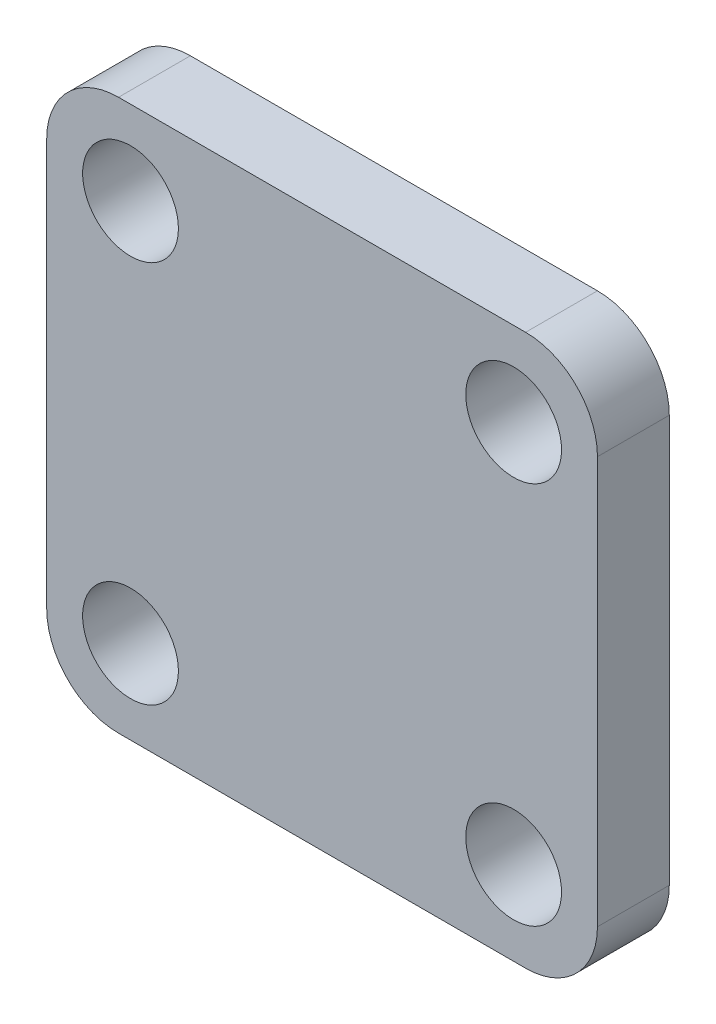
ISO-10303-21;
HEADER;
FILE_DESCRIPTION(('STEP AP214'),'2;1');
FILE_NAME('part.step','',(''),(''),'','','');
FILE_SCHEMA(('AUTOMOTIVE_DESIGN { 1 0 10303 214 1 1 1 1 }'));
ENDSEC;
DATA;
#1=APPLICATION_CONTEXT('core data for automotive mechanical design processes');
#2=APPLICATION_PROTOCOL_DEFINITION('international standard','automotive_design',2000,#1);
#3=PRODUCT_CONTEXT('',#1,'mechanical');
#4=PRODUCT('Part','Part','',(#3));
#5=PRODUCT_RELATED_PRODUCT_CATEGORY('part','',(#4));
#6=PRODUCT_DEFINITION_FORMATION('','',#4);
#7=PRODUCT_DEFINITION_CONTEXT('part definition',#1,'design');
#8=PRODUCT_DEFINITION('design','',#6,#7);
#9=PRODUCT_DEFINITION_SHAPE('','',#8);
#10=(LENGTH_UNIT() NAMED_UNIT(*) SI_UNIT(.MILLI.,.METRE.));
#11=(NAMED_UNIT(*) PLANE_ANGLE_UNIT() SI_UNIT($,.RADIAN.));
#12=(NAMED_UNIT(*) SI_UNIT($,.STERADIAN.) SOLID_ANGLE_UNIT());
#13=UNCERTAINTY_MEASURE_WITH_UNIT(LENGTH_MEASURE(1.E-05),#10,'distance_accuracy_value','');
#14=(GEOMETRIC_REPRESENTATION_CONTEXT(3) GLOBAL_UNCERTAINTY_ASSIGNED_CONTEXT((#13)) GLOBAL_UNIT_ASSIGNED_CONTEXT((#10,
#11,#12)) REPRESENTATION_CONTEXT('',''));
#15=CARTESIAN_POINT('',(0.,0.,0.));
#16=DIRECTION('',(0.,0.,1.));
#17=DIRECTION('',(1.,0.,0.));
#18=AXIS2_PLACEMENT_3D('',#15,#16,#17);
#19=CARTESIAN_POINT('',(-8.5,-8.5,3.));
#20=DIRECTION('',(0.,0.,1.));
#21=DIRECTION('',(1.,0.,0.));
#22=AXIS2_PLACEMENT_3D('',#19,#20,#21);
#23=PLANE('',#22);
#24=CARTESIAN_POINT('',(8.00000000000002,-8.00000000000001,3.));
#25=DIRECTION('',(0.,0.,1.));
#26=DIRECTION('',(1.,0.,0.));
#27=AXIS2_PLACEMENT_3D('',#24,#25,#26);
#28=CIRCLE('',#27,2.);
#29=CARTESIAN_POINT('',(10.,-8.00000000000001,3.));
#30=VERTEX_POINT('',#29);
#31=EDGE_CURVE('E190',#30,#30,#28,.T.);
#32=ORIENTED_EDGE('',*,*,#31,.F.);
#33=EDGE_LOOP('',(#32));
#34=FACE_BOUND('',#33,.T.);
#35=CARTESIAN_POINT('',(-8.00000000000002,8.00000000000002,3.));
#36=DIRECTION('',(0.,0.,1.));
#37=DIRECTION('',(1.,0.,0.));
#38=AXIS2_PLACEMENT_3D('',#35,#36,#37);
#39=CIRCLE('',#38,2.);
#40=CARTESIAN_POINT('',(-6.00000000000002,8.00000000000002,3.));
#41=VERTEX_POINT('',#40);
#42=EDGE_CURVE('E136',#41,#41,#39,.T.);
#43=ORIENTED_EDGE('',*,*,#42,.F.);
#44=EDGE_LOOP('',(#43));
#45=FACE_BOUND('',#44,.T.);
#46=CARTESIAN_POINT('',(-8.5,-8.5,3.));
#47=DIRECTION('',(0.,0.,1.));
#48=DIRECTION('',(1.,0.,0.));
#49=AXIS2_PLACEMENT_3D('',#46,#47,#48);
#50=CIRCLE('',#49,3.);
#51=CARTESIAN_POINT('',(-11.5,-8.49999999999998,3.));
#52=VERTEX_POINT('',#51);
#53=CARTESIAN_POINT('',(-8.49999999999998,-11.5,3.));
#54=VERTEX_POINT('',#53);
#55=EDGE_CURVE('E147',#52,#54,#50,.T.);
#56=ORIENTED_EDGE('',*,*,#55,.T.);
#57=DIRECTION('',(1.,0.,0.));
#58=VECTOR('',#57,1.);
#59=CARTESIAN_POINT('',(-8.49999999999998,-11.5,3.));
#60=LINE('',#59,#58);
#61=CARTESIAN_POINT('',(8.49999999999998,-11.5,3.));
#62=VERTEX_POINT('',#61);
#63=EDGE_CURVE('E95',#54,#62,#60,.T.);
#64=ORIENTED_EDGE('',*,*,#63,.T.);
#65=CARTESIAN_POINT('',(8.5,-8.5,3.));
#66=DIRECTION('',(0.,0.,1.));
#67=DIRECTION('',(1.,0.,0.));
#68=AXIS2_PLACEMENT_3D('',#65,#66,#67);
#69=CIRCLE('',#68,3.);
#70=CARTESIAN_POINT('',(11.5,-8.49999999999998,3.));
#71=VERTEX_POINT('',#70);
#72=EDGE_CURVE('E162',#62,#71,#69,.T.);
#73=ORIENTED_EDGE('',*,*,#72,.T.);
#74=DIRECTION('',(0.,1.,0.));
#75=VECTOR('',#74,1.);
#76=CARTESIAN_POINT('',(11.5,8.49999999999998,3.));
#77=LINE('',#76,#75);
#78=CARTESIAN_POINT('',(11.5,8.49999999999998,3.));
#79=VERTEX_POINT('',#78);
#80=EDGE_CURVE('E175',#71,#79,#77,.T.);
#81=ORIENTED_EDGE('',*,*,#80,.T.);
#82=CARTESIAN_POINT('',(8.5,8.5,3.));
#83=DIRECTION('',(0.,0.,1.));
#84=DIRECTION('',(-1.,0.,0.));
#85=AXIS2_PLACEMENT_3D('',#82,#83,#84);
#86=CIRCLE('',#85,3.);
#87=CARTESIAN_POINT('',(8.49999999999998,11.5,3.));
#88=VERTEX_POINT('',#87);
#89=EDGE_CURVE('E114',#79,#88,#86,.T.);
#90=ORIENTED_EDGE('',*,*,#89,.T.);
#91=DIRECTION('',(-1.,0.,0.));
#92=VECTOR('',#91,1.);
#93=CARTESIAN_POINT('',(-8.49999999999998,11.5,3.));
#94=LINE('',#93,#92);
#95=CARTESIAN_POINT('',(-8.49999999999998,11.5,3.));
#96=VERTEX_POINT('',#95);
#97=EDGE_CURVE('E108',#88,#96,#94,.T.);
#98=ORIENTED_EDGE('',*,*,#97,.T.);
#99=CARTESIAN_POINT('',(-8.5,8.5,3.));
#100=DIRECTION('',(0.,0.,1.));
#101=DIRECTION('',(1.,0.,0.));
#102=AXIS2_PLACEMENT_3D('',#99,#100,#101);
#103=CIRCLE('',#102,3.);
#104=CARTESIAN_POINT('',(-11.5,8.49999999999998,3.));
#105=VERTEX_POINT('',#104);
#106=EDGE_CURVE('E112',#96,#105,#103,.T.);
#107=ORIENTED_EDGE('',*,*,#106,.T.);
#108=DIRECTION('',(0.,-1.,0.));
#109=VECTOR('',#108,1.);
#110=CARTESIAN_POINT('',(-11.5,8.49999999999998,3.));
#111=LINE('',#110,#109);
#112=EDGE_CURVE('E52',#105,#52,#111,.T.);
#113=ORIENTED_EDGE('',*,*,#112,.T.);
#114=EDGE_LOOP('',(#56,#64,#73,#81,#90,#98,#107,#113));
#115=FACE_BOUND('',#114,.T.);
#116=CARTESIAN_POINT('',(7.99999999999999,8.00000000000002,3.));
#117=DIRECTION('',(0.,0.,1.));
#118=DIRECTION('',(1.,0.,0.));
#119=AXIS2_PLACEMENT_3D('',#116,#117,#118);
#120=CIRCLE('',#119,2.);
#121=CARTESIAN_POINT('',(9.99999999999999,8.00000000000002,3.));
#122=VERTEX_POINT('',#121);
#123=EDGE_CURVE('E184',#122,#122,#120,.T.);
#124=ORIENTED_EDGE('',*,*,#123,.F.);
#125=EDGE_LOOP('',(#124));
#126=FACE_BOUND('',#125,.T.);
#127=CARTESIAN_POINT('',(-8.00000000000001,-8.00000000000002,3.));
#128=DIRECTION('',(0.,0.,1.));
#129=DIRECTION('',(1.,0.,0.));
#130=AXIS2_PLACEMENT_3D('',#127,#128,#129);
#131=CIRCLE('',#130,2.);
#132=CARTESIAN_POINT('',(-6.00000000000001,-8.00000000000002,3.));
#133=VERTEX_POINT('',#132);
#134=EDGE_CURVE('E196',#133,#133,#131,.T.);
#135=ORIENTED_EDGE('',*,*,#134,.F.);
#136=EDGE_LOOP('',(#135));
#137=FACE_BOUND('',#136,.T.);
#138=ADVANCED_FACE('F35',(#34,#45,#115,#126,#137),#23,.T.);
#139=CARTESIAN_POINT('',(-8.5,-8.5,0.));
#140=DIRECTION('',(0.,0.,1.));
#141=DIRECTION('',(1.,0.,0.));
#142=AXIS2_PLACEMENT_3D('',#139,#140,#141);
#143=PLANE('',#142);
#144=CARTESIAN_POINT('',(-8.5,-8.5,0.));
#145=DIRECTION('',(0.,0.,1.));
#146=DIRECTION('',(1.,0.,0.));
#147=AXIS2_PLACEMENT_3D('',#144,#145,#146);
#148=CIRCLE('',#147,3.);
#149=CARTESIAN_POINT('',(-11.5,-8.49999999999998,0.));
#150=VERTEX_POINT('',#149);
#151=CARTESIAN_POINT('',(-8.49999999999998,-11.5,0.));
#152=VERTEX_POINT('',#151);
#153=EDGE_CURVE('E132',#150,#152,#148,.T.);
#154=ORIENTED_EDGE('',*,*,#153,.F.);
#155=DIRECTION('',(0.,-1.,0.));
#156=VECTOR('',#155,1.);
#157=CARTESIAN_POINT('',(-11.5,8.49999999999998,0.));
#158=LINE('',#157,#156);
#159=CARTESIAN_POINT('',(-11.5,8.49999999999998,0.));
#160=VERTEX_POINT('',#159);
#161=EDGE_CURVE('E87',#160,#150,#158,.T.);
#162=ORIENTED_EDGE('',*,*,#161,.F.);
#163=CARTESIAN_POINT('',(-8.5,8.5,0.));
#164=DIRECTION('',(0.,0.,1.));
#165=DIRECTION('',(1.,0.,0.));
#166=AXIS2_PLACEMENT_3D('',#163,#164,#165);
#167=CIRCLE('',#166,3.);
#168=CARTESIAN_POINT('',(-8.49999999999998,11.5,0.));
#169=VERTEX_POINT('',#168);
#170=EDGE_CURVE('E81',#169,#160,#167,.T.);
#171=ORIENTED_EDGE('',*,*,#170,.F.);
#172=DIRECTION('',(-1.,0.,0.));
#173=VECTOR('',#172,1.);
#174=CARTESIAN_POINT('',(-8.49999999999998,11.5,0.));
#175=LINE('',#174,#173);
#176=CARTESIAN_POINT('',(8.49999999999998,11.5,0.));
#177=VERTEX_POINT('',#176);
#178=EDGE_CURVE('E122',#177,#169,#175,.T.);
#179=ORIENTED_EDGE('',*,*,#178,.F.);
#180=CARTESIAN_POINT('',(8.5,8.5,0.));
#181=DIRECTION('',(0.,0.,1.));
#182=DIRECTION('',(-1.,0.,0.));
#183=AXIS2_PLACEMENT_3D('',#180,#181,#182);
#184=CIRCLE('',#183,3.);
#185=CARTESIAN_POINT('',(11.5,8.49999999999998,0.));
#186=VERTEX_POINT('',#185);
#187=EDGE_CURVE('E142',#186,#177,#184,.T.);
#188=ORIENTED_EDGE('',*,*,#187,.F.);
#189=DIRECTION('',(0.,1.,0.));
#190=VECTOR('',#189,1.);
#191=CARTESIAN_POINT('',(11.5,8.49999999999998,0.));
#192=LINE('',#191,#190);
#193=CARTESIAN_POINT('',(11.5,-8.49999999999998,0.));
#194=VERTEX_POINT('',#193);
#195=EDGE_CURVE('E140',#194,#186,#192,.T.);
#196=ORIENTED_EDGE('',*,*,#195,.F.);
#197=CARTESIAN_POINT('',(8.5,-8.5,0.));
#198=DIRECTION('',(0.,0.,1.));
#199=DIRECTION('',(1.,0.,0.));
#200=AXIS2_PLACEMENT_3D('',#197,#198,#199);
#201=CIRCLE('',#200,3.);
#202=CARTESIAN_POINT('',(8.49999999999998,-11.5,0.));
#203=VERTEX_POINT('',#202);
#204=EDGE_CURVE('E138',#203,#194,#201,.T.);
#205=ORIENTED_EDGE('',*,*,#204,.F.);
#206=DIRECTION('',(1.,0.,0.));
#207=VECTOR('',#206,1.);
#208=CARTESIAN_POINT('',(-8.49999999999998,-11.5,0.));
#209=LINE('',#208,#207);
#210=EDGE_CURVE('E135',#152,#203,#209,.T.);
#211=ORIENTED_EDGE('',*,*,#210,.F.);
#212=EDGE_LOOP('',(#154,#162,#171,#179,#188,#196,#205,#211));
#213=FACE_BOUND('',#212,.T.);
#214=CARTESIAN_POINT('',(-8.00000000000002,8.00000000000002,0.));
#215=DIRECTION('',(0.,0.,1.));
#216=DIRECTION('',(1.,0.,0.));
#217=AXIS2_PLACEMENT_3D('',#214,#215,#216);
#218=CIRCLE('',#217,2.);
#219=CARTESIAN_POINT('',(-6.00000000000002,8.00000000000002,0.));
#220=VERTEX_POINT('',#219);
#221=EDGE_CURVE('E181',#220,#220,#218,.T.);
#222=ORIENTED_EDGE('',*,*,#221,.T.);
#223=EDGE_LOOP('',(#222));
#224=FACE_BOUND('',#223,.T.);
#225=CARTESIAN_POINT('',(7.99999999999999,8.00000000000002,0.));
#226=DIRECTION('',(0.,0.,1.));
#227=DIRECTION('',(1.,0.,0.));
#228=AXIS2_PLACEMENT_3D('',#225,#226,#227);
#229=CIRCLE('',#228,2.);
#230=CARTESIAN_POINT('',(9.99999999999999,8.00000000000002,0.));
#231=VERTEX_POINT('',#230);
#232=EDGE_CURVE('E187',#231,#231,#229,.T.);
#233=ORIENTED_EDGE('',*,*,#232,.T.);
#234=EDGE_LOOP('',(#233));
#235=FACE_BOUND('',#234,.T.);
#236=CARTESIAN_POINT('',(8.00000000000002,-8.00000000000001,0.));
#237=DIRECTION('',(0.,0.,1.));
#238=DIRECTION('',(1.,0.,0.));
#239=AXIS2_PLACEMENT_3D('',#236,#237,#238);
#240=CIRCLE('',#239,2.);
#241=CARTESIAN_POINT('',(10.,-8.00000000000001,0.));
#242=VERTEX_POINT('',#241);
#243=EDGE_CURVE('E193',#242,#242,#240,.T.);
#244=ORIENTED_EDGE('',*,*,#243,.T.);
#245=EDGE_LOOP('',(#244));
#246=FACE_BOUND('',#245,.T.);
#247=CARTESIAN_POINT('',(-8.00000000000001,-8.00000000000002,0.));
#248=DIRECTION('',(0.,0.,1.));
#249=DIRECTION('',(1.,0.,0.));
#250=AXIS2_PLACEMENT_3D('',#247,#248,#249);
#251=CIRCLE('',#250,2.);
#252=CARTESIAN_POINT('',(-6.00000000000001,-8.00000000000002,0.));
#253=VERTEX_POINT('',#252);
#254=EDGE_CURVE('E199',#253,#253,#251,.T.);
#255=ORIENTED_EDGE('',*,*,#254,.T.);
#256=EDGE_LOOP('',(#255));
#257=FACE_BOUND('',#256,.T.);
#258=ADVANCED_FACE('F166',(#213,#224,#235,#246,#257),#143,.F.);
#259=CARTESIAN_POINT('',(-8.5,-8.5,3.));
#260=DIRECTION('',(0.,0.,-1.));
#261=DIRECTION('',(-1.,0.,0.));
#262=AXIS2_PLACEMENT_3D('',#259,#260,#261);
#263=CYLINDRICAL_SURFACE('',#262,3.);
#264=ORIENTED_EDGE('',*,*,#153,.T.);
#265=DIRECTION('',(0.,0.,-1.));
#266=VECTOR('',#265,1.);
#267=CARTESIAN_POINT('',(-8.49999999999998,-11.5,3.));
#268=LINE('',#267,#266);
#269=EDGE_CURVE('E11',#54,#152,#268,.T.);
#270=ORIENTED_EDGE('',*,*,#269,.F.);
#271=ORIENTED_EDGE('',*,*,#55,.F.);
#272=DIRECTION('',(0.,0.,-1.));
#273=VECTOR('',#272,1.);
#274=CARTESIAN_POINT('',(-11.5,-8.49999999999998,3.));
#275=LINE('',#274,#273);
#276=EDGE_CURVE('E128',#52,#150,#275,.T.);
#277=ORIENTED_EDGE('',*,*,#276,.T.);
#278=EDGE_LOOP('',(#264,#270,#271,#277));
#279=FACE_BOUND('',#278,.T.);
#280=ADVANCED_FACE('F37',(#279),#263,.T.);
#281=CARTESIAN_POINT('',(-8.49999999999998,-11.5,3.));
#282=DIRECTION('',(0.,1.,0.));
#283=DIRECTION('',(0.,0.,1.));
#284=AXIS2_PLACEMENT_3D('',#281,#282,#283);
#285=PLANE('',#284);
#286=ORIENTED_EDGE('',*,*,#210,.T.);
#287=DIRECTION('',(0.,0.,-1.));
#288=VECTOR('',#287,1.);
#289=CARTESIAN_POINT('',(8.49999999999998,-11.5,3.));
#290=LINE('',#289,#288);
#291=EDGE_CURVE('E44',#62,#203,#290,.T.);
#292=ORIENTED_EDGE('',*,*,#291,.F.);
#293=ORIENTED_EDGE('',*,*,#63,.F.);
#294=ORIENTED_EDGE('',*,*,#269,.T.);
#295=EDGE_LOOP('',(#286,#292,#293,#294));
#296=FACE_BOUND('',#295,.T.);
#297=ADVANCED_FACE('F233',(#296),#285,.F.);
#298=CARTESIAN_POINT('',(8.5,-8.5,3.));
#299=DIRECTION('',(0.,0.,-1.));
#300=DIRECTION('',(-1.,0.,0.));
#301=AXIS2_PLACEMENT_3D('',#298,#299,#300);
#302=CYLINDRICAL_SURFACE('',#301,3.);
#303=ORIENTED_EDGE('',*,*,#204,.T.);
#304=DIRECTION('',(0.,0.,-1.));
#305=VECTOR('',#304,1.);
#306=CARTESIAN_POINT('',(11.5,-8.49999999999998,3.));
#307=LINE('',#306,#305);
#308=EDGE_CURVE('E154',#71,#194,#307,.T.);
#309=ORIENTED_EDGE('',*,*,#308,.F.);
#310=ORIENTED_EDGE('',*,*,#72,.F.);
#311=ORIENTED_EDGE('',*,*,#291,.T.);
#312=EDGE_LOOP('',(#303,#309,#310,#311));
#313=FACE_BOUND('',#312,.T.);
#314=ADVANCED_FACE('F160',(#313),#302,.T.);
#315=CARTESIAN_POINT('',(11.5,8.49999999999998,3.));
#316=DIRECTION('',(-1.,0.,0.));
#317=DIRECTION('',(0.,-1.,0.));
#318=AXIS2_PLACEMENT_3D('',#315,#316,#317);
#319=PLANE('',#318);
#320=ORIENTED_EDGE('',*,*,#195,.T.);
#321=DIRECTION('',(0.,0.,-1.));
#322=VECTOR('',#321,1.);
#323=CARTESIAN_POINT('',(11.5,8.49999999999998,3.));
#324=LINE('',#323,#322);
#325=EDGE_CURVE('E151',#79,#186,#324,.T.);
#326=ORIENTED_EDGE('',*,*,#325,.F.);
#327=ORIENTED_EDGE('',*,*,#80,.F.);
#328=ORIENTED_EDGE('',*,*,#308,.T.);
#329=EDGE_LOOP('',(#320,#326,#327,#328));
#330=FACE_BOUND('',#329,.T.);
#331=ADVANCED_FACE('F171',(#330),#319,.F.);
#332=CARTESIAN_POINT('',(8.5,8.5,3.));
#333=DIRECTION('',(0.,0.,-1.));
#334=DIRECTION('',(-1.,0.,0.));
#335=AXIS2_PLACEMENT_3D('',#332,#333,#334);
#336=CYLINDRICAL_SURFACE('',#335,3.);
#337=ORIENTED_EDGE('',*,*,#187,.T.);
#338=DIRECTION('',(0.,0.,-1.));
#339=VECTOR('',#338,1.);
#340=CARTESIAN_POINT('',(8.49999999999998,11.5,3.));
#341=LINE('',#340,#339);
#342=EDGE_CURVE('E123',#88,#177,#341,.T.);
#343=ORIENTED_EDGE('',*,*,#342,.F.);
#344=ORIENTED_EDGE('',*,*,#89,.F.);
#345=ORIENTED_EDGE('',*,*,#325,.T.);
#346=EDGE_LOOP('',(#337,#343,#344,#345));
#347=FACE_BOUND('',#346,.T.);
#348=ADVANCED_FACE('F174',(#347),#336,.T.);
#349=CARTESIAN_POINT('',(-8.49999999999998,11.5,3.));
#350=DIRECTION('',(0.,-1.,0.));
#351=DIRECTION('',(0.,0.,-1.));
#352=AXIS2_PLACEMENT_3D('',#349,#350,#351);
#353=PLANE('',#352);
#354=ORIENTED_EDGE('',*,*,#178,.T.);
#355=DIRECTION('',(0.,0.,-1.));
#356=VECTOR('',#355,1.);
#357=CARTESIAN_POINT('',(-8.49999999999998,11.5,3.));
#358=LINE('',#357,#356);
#359=EDGE_CURVE('E119',#96,#169,#358,.T.);
#360=ORIENTED_EDGE('',*,*,#359,.F.);
#361=ORIENTED_EDGE('',*,*,#97,.F.);
#362=ORIENTED_EDGE('',*,*,#342,.T.);
#363=EDGE_LOOP('',(#354,#360,#361,#362));
#364=FACE_BOUND('',#363,.T.);
#365=ADVANCED_FACE('F120',(#364),#353,.F.);
#366=CARTESIAN_POINT('',(-8.5,8.5,3.));
#367=DIRECTION('',(0.,0.,-1.));
#368=DIRECTION('',(-1.,0.,0.));
#369=AXIS2_PLACEMENT_3D('',#366,#367,#368);
#370=CYLINDRICAL_SURFACE('',#369,3.);
#371=ORIENTED_EDGE('',*,*,#170,.T.);
#372=DIRECTION('',(0.,0.,-1.));
#373=VECTOR('',#372,1.);
#374=CARTESIAN_POINT('',(-11.5,8.49999999999998,3.));
#375=LINE('',#374,#373);
#376=EDGE_CURVE('E124',#105,#160,#375,.T.);
#377=ORIENTED_EDGE('',*,*,#376,.F.);
#378=ORIENTED_EDGE('',*,*,#106,.F.);
#379=ORIENTED_EDGE('',*,*,#359,.T.);
#380=EDGE_LOOP('',(#371,#377,#378,#379));
#381=FACE_BOUND('',#380,.T.);
#382=ADVANCED_FACE('F126',(#381),#370,.T.);
#383=CARTESIAN_POINT('',(-11.5,8.49999999999998,3.));
#384=DIRECTION('',(1.,0.,0.));
#385=DIRECTION('',(0.,1.,0.));
#386=AXIS2_PLACEMENT_3D('',#383,#384,#385);
#387=PLANE('',#386);
#388=ORIENTED_EDGE('',*,*,#161,.T.);
#389=ORIENTED_EDGE('',*,*,#276,.F.);
#390=ORIENTED_EDGE('',*,*,#112,.F.);
#391=ORIENTED_EDGE('',*,*,#376,.T.);
#392=EDGE_LOOP('',(#388,#389,#390,#391));
#393=FACE_BOUND('',#392,.T.);
#394=ADVANCED_FACE('F221',(#393),#387,.F.);
#395=CARTESIAN_POINT('',(-8.00000000000002,8.00000000000002,3.));
#396=DIRECTION('',(0.,0.,-1.));
#397=DIRECTION('',(-1.,0.,0.));
#398=AXIS2_PLACEMENT_3D('',#395,#396,#397);
#399=CYLINDRICAL_SURFACE('',#398,2.);
#400=ORIENTED_EDGE('',*,*,#42,.T.);
#401=EDGE_LOOP('',(#400));
#402=FACE_BOUND('',#401,.T.);
#403=ORIENTED_EDGE('',*,*,#221,.F.);
#404=EDGE_LOOP('',(#403));
#405=FACE_BOUND('',#404,.T.);
#406=ADVANCED_FACE('F218',(#402,#405),#399,.F.);
#407=CARTESIAN_POINT('',(7.99999999999999,8.00000000000002,3.));
#408=DIRECTION('',(0.,0.,-1.));
#409=DIRECTION('',(-1.,0.,0.));
#410=AXIS2_PLACEMENT_3D('',#407,#408,#409);
#411=CYLINDRICAL_SURFACE('',#410,2.);
#412=ORIENTED_EDGE('',*,*,#123,.T.);
#413=EDGE_LOOP('',(#412));
#414=FACE_BOUND('',#413,.T.);
#415=ORIENTED_EDGE('',*,*,#232,.F.);
#416=EDGE_LOOP('',(#415));
#417=FACE_BOUND('',#416,.T.);
#418=ADVANCED_FACE('F297',(#414,#417),#411,.F.);
#419=CARTESIAN_POINT('',(8.00000000000002,-8.00000000000001,3.));
#420=DIRECTION('',(0.,0.,-1.));
#421=DIRECTION('',(-1.,0.,0.));
#422=AXIS2_PLACEMENT_3D('',#419,#420,#421);
#423=CYLINDRICAL_SURFACE('',#422,2.);
#424=ORIENTED_EDGE('',*,*,#31,.T.);
#425=EDGE_LOOP('',(#424));
#426=FACE_BOUND('',#425,.T.);
#427=ORIENTED_EDGE('',*,*,#243,.F.);
#428=EDGE_LOOP('',(#427));
#429=FACE_BOUND('',#428,.T.);
#430=ADVANCED_FACE('F305',(#426,#429),#423,.F.);
#431=CARTESIAN_POINT('',(-8.00000000000001,-8.00000000000002,3.));
#432=DIRECTION('',(0.,0.,-1.));
#433=DIRECTION('',(-1.,0.,0.));
#434=AXIS2_PLACEMENT_3D('',#431,#432,#433);
#435=CYLINDRICAL_SURFACE('',#434,2.);
#436=ORIENTED_EDGE('',*,*,#134,.T.);
#437=EDGE_LOOP('',(#436));
#438=FACE_BOUND('',#437,.T.);
#439=ORIENTED_EDGE('',*,*,#254,.F.);
#440=EDGE_LOOP('',(#439));
#441=FACE_BOUND('',#440,.T.);
#442=ADVANCED_FACE('F205',(#438,#441),#435,.F.);
#443=CLOSED_SHELL('',(#138,#258,#280,#297,#314,#331,#348,#365,#382,#394,#406,#418,#430,#442));
#444=MANIFOLD_SOLID_BREP('B2',#443);
#445=ADVANCED_BREP_SHAPE_REPRESENTATION('',(#18,#444),#14);
#446=SHAPE_DEFINITION_REPRESENTATION(#9,#445);
ENDSEC;
END-ISO-10303-21;
